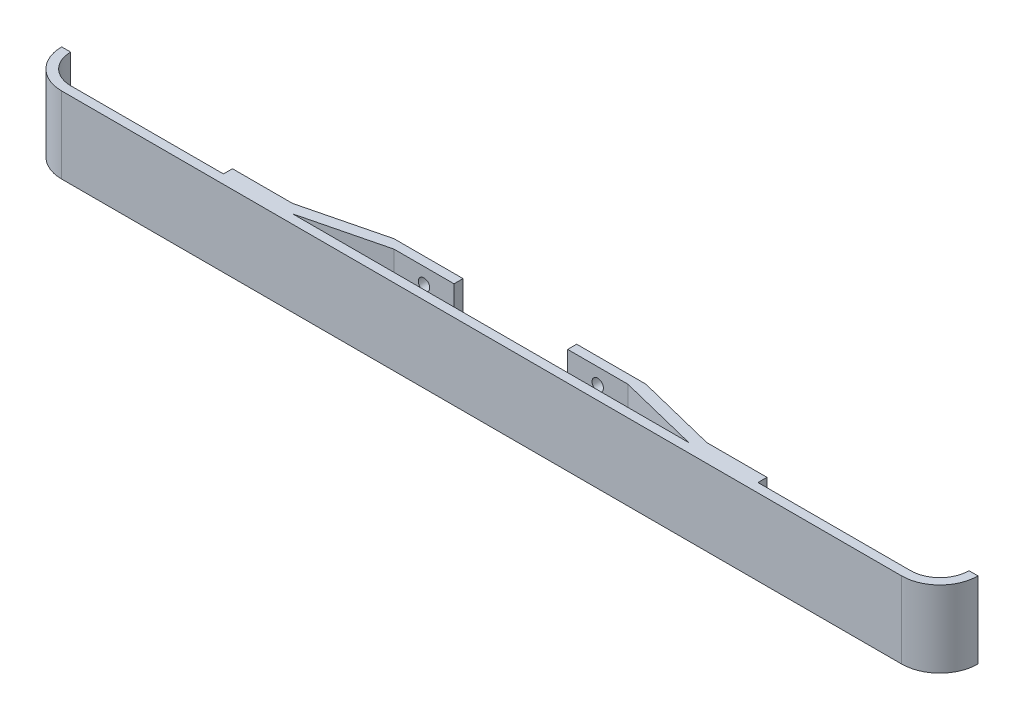
ISO-10303-21;
HEADER;
FILE_DESCRIPTION(('STEP AP214'),'2;1');
FILE_NAME('part.step','',(''),(''),'','','');
FILE_SCHEMA(('AUTOMOTIVE_DESIGN { 1 0 10303 214 1 1 1 1 }'));
ENDSEC;
DATA;
#1=APPLICATION_CONTEXT('core data for automotive mechanical design processes');
#2=APPLICATION_PROTOCOL_DEFINITION('international standard','automotive_design',2000,#1);
#3=PRODUCT_CONTEXT('',#1,'mechanical');
#4=PRODUCT('Part','Part','',(#3));
#5=PRODUCT_RELATED_PRODUCT_CATEGORY('part','',(#4));
#6=PRODUCT_DEFINITION_FORMATION('','',#4);
#7=PRODUCT_DEFINITION_CONTEXT('part definition',#1,'design');
#8=PRODUCT_DEFINITION('design','',#6,#7);
#9=PRODUCT_DEFINITION_SHAPE('','',#8);
#10=(LENGTH_UNIT() NAMED_UNIT(*) SI_UNIT(.MILLI.,.METRE.));
#11=(NAMED_UNIT(*) PLANE_ANGLE_UNIT() SI_UNIT($,.RADIAN.));
#12=(NAMED_UNIT(*) SI_UNIT($,.STERADIAN.) SOLID_ANGLE_UNIT());
#13=UNCERTAINTY_MEASURE_WITH_UNIT(LENGTH_MEASURE(1.E-05),#10,'distance_accuracy_value','');
#14=(GEOMETRIC_REPRESENTATION_CONTEXT(3) GLOBAL_UNCERTAINTY_ASSIGNED_CONTEXT((#13)) GLOBAL_UNIT_ASSIGNED_CONTEXT((#10,
#11,#12)) REPRESENTATION_CONTEXT('',''));
#15=CARTESIAN_POINT('',(0.,0.,0.));
#16=DIRECTION('',(0.,0.,1.));
#17=DIRECTION('',(1.,0.,0.));
#18=AXIS2_PLACEMENT_3D('',#15,#16,#17);
#19=CARTESIAN_POINT('',(107.466978193146,-14.8364485981308,3.));
#20=DIRECTION('',(0.,0.,-1.));
#21=DIRECTION('',(-1.,0.,0.));
#22=AXIS2_PLACEMENT_3D('',#19,#20,#21);
#23=PLANE('',#22);
#24=CARTESIAN_POINT('',(97.4669781931466,-9.63644859813084,3.00000000000002));
#25=DIRECTION('',(0.,0.,1.));
#26=DIRECTION('',(1.,0.,0.));
#27=AXIS2_PLACEMENT_3D('',#24,#25,#26);
#28=CIRCLE('',#27,1.89864999999999);
#29=CARTESIAN_POINT('',(99.3656281931465,-9.63644859813084,3.00000000000002));
#30=VERTEX_POINT('',#29);
#31=EDGE_CURVE('E756',#30,#30,#28,.T.);
#32=ORIENTED_EDGE('',*,*,#31,.F.);
#33=EDGE_LOOP('',(#32));
#34=FACE_BOUND('',#33,.T.);
#35=DIRECTION('',(-1.,0.,0.));
#36=VECTOR('',#35,1.);
#37=CARTESIAN_POINT('',(107.466978193146,10.5635514018692,3.));
#38=LINE('',#37,#36);
#39=CARTESIAN_POINT('',(107.466978193146,10.5635514018692,3.));
#40=VERTEX_POINT('',#39);
#41=CARTESIAN_POINT('',(87.4669781931464,10.5635514018692,3.));
#42=VERTEX_POINT('',#41);
#43=EDGE_CURVE('E395',#40,#42,#38,.T.);
#44=ORIENTED_EDGE('',*,*,#43,.T.);
#45=DIRECTION('',(0.,1.,0.));
#46=VECTOR('',#45,1.);
#47=CARTESIAN_POINT('',(87.4669781931464,-14.8364485981308,3.));
#48=LINE('',#47,#46);
#49=CARTESIAN_POINT('',(87.4669781931464,-14.8364485981308,3.));
#50=VERTEX_POINT('',#49);
#51=EDGE_CURVE('E407',#50,#42,#48,.T.);
#52=ORIENTED_EDGE('',*,*,#51,.F.);
#53=DIRECTION('',(-1.,0.,0.));
#54=VECTOR('',#53,1.);
#55=CARTESIAN_POINT('',(107.466978193146,-14.8364485981308,3.));
#56=LINE('',#55,#54);
#57=CARTESIAN_POINT('',(107.466978193146,-14.8364485981308,3.));
#58=VERTEX_POINT('',#57);
#59=EDGE_CURVE('E49',#58,#50,#56,.T.);
#60=ORIENTED_EDGE('',*,*,#59,.F.);
#61=DIRECTION('',(0.,1.,0.));
#62=VECTOR('',#61,1.);
#63=CARTESIAN_POINT('',(107.466978193146,-14.8364485981308,3.));
#64=LINE('',#63,#62);
#65=EDGE_CURVE('E385',#58,#40,#64,.T.);
#66=ORIENTED_EDGE('',*,*,#65,.T.);
#67=EDGE_LOOP('',(#44,#52,#60,#66));
#68=FACE_BOUND('',#67,.T.);
#69=CARTESIAN_POINT('',(97.4669781931464,5.36355140186916,3.00000000000002));
#70=DIRECTION('',(0.,0.,1.));
#71=DIRECTION('',(1.,0.,0.));
#72=AXIS2_PLACEMENT_3D('',#69,#70,#71);
#73=CIRCLE('',#72,1.89864999999999);
#74=CARTESIAN_POINT('',(99.3656281931464,5.36355140186916,3.00000000000002));
#75=VERTEX_POINT('',#74);
#76=EDGE_CURVE('E737',#75,#75,#73,.T.);
#77=ORIENTED_EDGE('',*,*,#76,.F.);
#78=EDGE_LOOP('',(#77));
#79=FACE_BOUND('',#78,.T.);
#80=ADVANCED_FACE('F34',(#34,#68,#79),#23,.F.);
#81=CARTESIAN_POINT('',(-13.3330218068536,-14.8364485981308,9.7));
#82=DIRECTION('',(0.,0.,1.));
#83=DIRECTION('',(1.,0.,0.));
#84=AXIS2_PLACEMENT_3D('',#81,#82,#83);
#85=PLANE('',#84);
#86=DIRECTION('',(0.,1.,0.));
#87=VECTOR('',#86,1.);
#88=CARTESIAN_POINT('',(37.4669781931464,10.5635514018692,9.7));
#89=LINE('',#88,#87);
#90=CARTESIAN_POINT('',(37.4669781931464,-14.8364485981308,9.7));
#91=VERTEX_POINT('',#90);
#92=CARTESIAN_POINT('',(37.4669781931464,10.5635514018692,9.7));
#93=VERTEX_POINT('',#92);
#94=EDGE_CURVE('E229',#91,#93,#89,.T.);
#95=ORIENTED_EDGE('',*,*,#94,.F.);
#96=DIRECTION('',(1.,0.,0.));
#97=VECTOR('',#96,1.);
#98=CARTESIAN_POINT('',(-13.3330218068536,-14.8364485981308,9.7));
#99=LINE('',#98,#97);
#100=CARTESIAN_POINT('',(-13.3330218068536,-14.8364485981308,9.7));
#101=VERTEX_POINT('',#100);
#102=EDGE_CURVE('E218',#101,#91,#99,.T.);
#103=ORIENTED_EDGE('',*,*,#102,.F.);
#104=DIRECTION('',(0.,1.,0.));
#105=VECTOR('',#104,1.);
#106=CARTESIAN_POINT('',(-13.3330218068536,-14.8364485981308,9.7));
#107=LINE('',#106,#105);
#108=CARTESIAN_POINT('',(-13.3330218068536,10.5635514018692,9.7));
#109=VERTEX_POINT('',#108);
#110=EDGE_CURVE('E278',#101,#109,#107,.T.);
#111=ORIENTED_EDGE('',*,*,#110,.T.);
#112=DIRECTION('',(1.,0.,0.));
#113=VECTOR('',#112,1.);
#114=CARTESIAN_POINT('',(-13.3330218068536,10.5635514018692,9.7));
#115=LINE('',#114,#113);
#116=EDGE_CURVE('E260',#109,#93,#115,.T.);
#117=ORIENTED_EDGE('',*,*,#116,.T.);
#118=EDGE_LOOP('',(#95,#103,#111,#117));
#119=FACE_BOUND('',#118,.T.);
#120=ADVANCED_FACE('F452',(#119),#85,.F.);
#121=CARTESIAN_POINT('',(60.4669781931464,-14.8364485981308,9.7));
#122=VERTEX_POINT('',#121);
#123=CARTESIAN_POINT('',(192.266978193146,-14.8364485981308,9.7));
#124=VERTEX_POINT('',#123);
#125=EDGE_CURVE('E265',#122,#124,#99,.T.);
#126=ORIENTED_EDGE('',*,*,#125,.F.);
#127=DIRECTION('',(0.,1.,0.));
#128=VECTOR('',#127,1.);
#129=CARTESIAN_POINT('',(60.4669781931464,-14.8364485981308,9.7));
#130=LINE('',#129,#128);
#131=CARTESIAN_POINT('',(60.4669781931464,10.5635514018692,9.7));
#132=VERTEX_POINT('',#131);
#133=EDGE_CURVE('E346',#122,#132,#130,.T.);
#134=ORIENTED_EDGE('',*,*,#133,.T.);
#135=CARTESIAN_POINT('',(192.266978193146,10.5635514018692,9.7));
#136=VERTEX_POINT('',#135);
#137=EDGE_CURVE('E273',#132,#136,#115,.T.);
#138=ORIENTED_EDGE('',*,*,#137,.T.);
#139=DIRECTION('',(0.,1.,0.));
#140=VECTOR('',#139,1.);
#141=CARTESIAN_POINT('',(192.266978193146,-14.8364485981308,9.7));
#142=LINE('',#141,#140);
#143=EDGE_CURVE('E343',#124,#136,#142,.T.);
#144=ORIENTED_EDGE('',*,*,#143,.F.);
#145=EDGE_LOOP('',(#126,#134,#138,#144));
#146=FACE_BOUND('',#145,.T.);
#147=ADVANCED_FACE('F342',(#146),#85,.F.);
#148=DIRECTION('',(0.,-1.,0.));
#149=VECTOR('',#148,1.);
#150=CARTESIAN_POINT('',(215.266978193146,10.5635514018692,9.7));
#151=LINE('',#150,#149);
#152=CARTESIAN_POINT('',(215.266978193146,10.5635514018692,9.7));
#153=VERTEX_POINT('',#152);
#154=CARTESIAN_POINT('',(215.266978193146,-14.8364485981308,9.7));
#155=VERTEX_POINT('',#154);
#156=EDGE_CURVE('E234',#153,#155,#151,.T.);
#157=ORIENTED_EDGE('',*,*,#156,.F.);
#158=CARTESIAN_POINT('',(266.066978193146,10.5635514018692,9.69999999999999));
#159=VERTEX_POINT('',#158);
#160=EDGE_CURVE('E270',#153,#159,#115,.T.);
#161=ORIENTED_EDGE('',*,*,#160,.T.);
#162=DIRECTION('',(0.,1.,0.));
#163=VECTOR('',#162,1.);
#164=CARTESIAN_POINT('',(266.066978193146,-14.8364485981308,9.69999999999999));
#165=LINE('',#164,#163);
#166=CARTESIAN_POINT('',(266.066978193146,-14.8364485981308,9.69999999999999));
#167=VERTEX_POINT('',#166);
#168=EDGE_CURVE('E274',#167,#159,#165,.T.);
#169=ORIENTED_EDGE('',*,*,#168,.F.);
#170=EDGE_CURVE('E262',#155,#167,#99,.T.);
#171=ORIENTED_EDGE('',*,*,#170,.F.);
#172=EDGE_LOOP('',(#157,#161,#169,#171));
#173=FACE_BOUND('',#172,.T.);
#174=ADVANCED_FACE('F334',(#173),#85,.F.);
#175=CARTESIAN_POINT('',(0.,0.,0.));
#176=DIRECTION('',(0.,0.,1.));
#177=DIRECTION('',(1.,0.,0.));
#178=AXIS2_PLACEMENT_3D('',#175,#176,#177);
#179=PLANE('',#178);
#180=DIRECTION('',(1.,0.,0.));
#181=VECTOR('',#180,1.);
#182=CARTESIAN_POINT('',(-26.0330218068536,-14.8364485981308,0.));
#183=LINE('',#182,#181);
#184=CARTESIAN_POINT('',(275.766978193146,-14.8364485981308,0.));
#185=VERTEX_POINT('',#184);
#186=CARTESIAN_POINT('',(278.766978193146,-14.8364485981308,0.));
#187=VERTEX_POINT('',#186);
#188=EDGE_CURVE('E294',#185,#187,#183,.T.);
#189=ORIENTED_EDGE('',*,*,#188,.F.);
#190=DIRECTION('',(0.,1.,0.));
#191=VECTOR('',#190,1.);
#192=CARTESIAN_POINT('',(275.766978193146,-14.8364485981308,0.));
#193=LINE('',#192,#191);
#194=CARTESIAN_POINT('',(275.766978193146,10.5635514018692,0.));
#195=VERTEX_POINT('',#194);
#196=EDGE_CURVE('E264',#185,#195,#193,.T.);
#197=ORIENTED_EDGE('',*,*,#196,.T.);
#198=DIRECTION('',(1.,0.,0.));
#199=VECTOR('',#198,1.);
#200=CARTESIAN_POINT('',(-26.0330218068536,10.5635514018692,0.));
#201=LINE('',#200,#199);
#202=CARTESIAN_POINT('',(278.766978193146,10.5635514018692,0.));
#203=VERTEX_POINT('',#202);
#204=EDGE_CURVE('E301',#195,#203,#201,.T.);
#205=ORIENTED_EDGE('',*,*,#204,.T.);
#206=DIRECTION('',(0.,-1.,0.));
#207=VECTOR('',#206,1.);
#208=CARTESIAN_POINT('',(278.766978193146,10.5635514018692,0.));
#209=LINE('',#208,#207);
#210=EDGE_CURVE('E298',#203,#187,#209,.T.);
#211=ORIENTED_EDGE('',*,*,#210,.T.);
#212=EDGE_LOOP('',(#189,#197,#205,#211));
#213=FACE_BOUND('',#212,.T.);
#214=ADVANCED_FACE('F324',(#213),#179,.F.);
#215=CARTESIAN_POINT('',(-26.0330218068536,-14.8364485981308,12.7));
#216=DIRECTION('',(0.,1.,0.));
#217=DIRECTION('',(-1.,0.,0.));
#218=AXIS2_PLACEMENT_3D('',#215,#216,#217);
#219=PLANE('',#218);
#220=DIRECTION('',(1.,0.,0.));
#221=VECTOR('',#220,1.);
#222=CARTESIAN_POINT('',(37.4669781931464,-14.8364485981308,6.7));
#223=LINE('',#222,#221);
#224=CARTESIAN_POINT('',(37.4669781931464,-14.8364485981308,6.7));
#225=VERTEX_POINT('',#224);
#226=CARTESIAN_POINT('',(57.4669781931464,-14.8364485981308,6.7));
#227=VERTEX_POINT('',#226);
#228=EDGE_CURVE('E193',#225,#227,#223,.T.);
#229=ORIENTED_EDGE('',*,*,#228,.T.);
#230=DIRECTION('',(0.970563929002576,0.,-0.24084364164138));
#231=VECTOR('',#230,1.);
#232=CARTESIAN_POINT('',(57.4669781931464,-14.8364485981308,6.7));
#233=LINE('',#232,#231);
#234=CARTESIAN_POINT('',(84.4669781931464,-14.8364485981308,0.));
#235=VERTEX_POINT('',#234);
#236=EDGE_CURVE('E204',#227,#235,#233,.T.);
#237=ORIENTED_EDGE('',*,*,#236,.T.);
#238=DIRECTION('',(-1.,0.,0.));
#239=VECTOR('',#238,1.);
#240=CARTESIAN_POINT('',(37.4669781931464,-14.8364485981308,0.));
#241=LINE('',#240,#239);
#242=CARTESIAN_POINT('',(107.466978193146,-14.8364485981308,0.));
#243=VERTEX_POINT('',#242);
#244=EDGE_CURVE('E220',#243,#235,#241,.T.);
#245=ORIENTED_EDGE('',*,*,#244,.F.);
#246=DIRECTION('',(0.,0.,1.));
#247=VECTOR('',#246,1.);
#248=CARTESIAN_POINT('',(107.466978193146,-14.8364485981308,0.));
#249=LINE('',#248,#247);
#250=EDGE_CURVE('E219',#243,#58,#249,.T.);
#251=ORIENTED_EDGE('',*,*,#250,.T.);
#252=ORIENTED_EDGE('',*,*,#59,.T.);
#253=DIRECTION('',(-0.970563929002577,0.,0.24084364164138));
#254=VECTOR('',#253,1.);
#255=CARTESIAN_POINT('',(87.4669781931464,-14.8364485981308,3.));
#256=LINE('',#255,#254);
#257=EDGE_CURVE('E398',#50,#122,#256,.T.);
#258=ORIENTED_EDGE('',*,*,#257,.T.);
#259=ORIENTED_EDGE('',*,*,#125,.T.);
#260=DIRECTION('',(-0.970563929002576,0.,-0.24084364164138));
#261=VECTOR('',#260,1.);
#262=CARTESIAN_POINT('',(192.266978193146,-14.8364485981308,9.7));
#263=LINE('',#262,#261);
#264=CARTESIAN_POINT('',(165.266978193146,-14.8364485981308,3.));
#265=VERTEX_POINT('',#264);
#266=EDGE_CURVE('E356',#124,#265,#263,.T.);
#267=ORIENTED_EDGE('',*,*,#266,.T.);
#268=DIRECTION('',(-1.,0.,0.));
#269=VECTOR('',#268,1.);
#270=CARTESIAN_POINT('',(165.266978193146,-14.8364485981308,3.));
#271=LINE('',#270,#269);
#272=CARTESIAN_POINT('',(145.266978193146,-14.8364485981308,3.));
#273=VERTEX_POINT('',#272);
#274=EDGE_CURVE('E358',#265,#273,#271,.T.);
#275=ORIENTED_EDGE('',*,*,#274,.T.);
#276=DIRECTION('',(0.,0.,1.));
#277=VECTOR('',#276,1.);
#278=CARTESIAN_POINT('',(145.266978193146,-14.8364485981308,0.));
#279=LINE('',#278,#277);
#280=CARTESIAN_POINT('',(145.266978193146,-14.8364485981308,0.));
#281=VERTEX_POINT('',#280);
#282=EDGE_CURVE('E243',#281,#273,#279,.T.);
#283=ORIENTED_EDGE('',*,*,#282,.F.);
#284=DIRECTION('',(-1.,0.,0.));
#285=VECTOR('',#284,1.);
#286=CARTESIAN_POINT('',(145.266978193146,-14.8364485981308,0.));
#287=LINE('',#286,#285);
#288=CARTESIAN_POINT('',(168.266978193146,-14.8364485981308,0.));
#289=VERTEX_POINT('',#288);
#290=EDGE_CURVE('E241',#289,#281,#287,.T.);
#291=ORIENTED_EDGE('',*,*,#290,.F.);
#292=DIRECTION('',(0.970563929002576,0.,0.24084364164138));
#293=VECTOR('',#292,1.);
#294=CARTESIAN_POINT('',(195.266978193146,-14.8364485981308,6.7));
#295=LINE('',#294,#293);
#296=CARTESIAN_POINT('',(195.266978193146,-14.8364485981308,6.7));
#297=VERTEX_POINT('',#296);
#298=EDGE_CURVE('E410',#289,#297,#295,.T.);
#299=ORIENTED_EDGE('',*,*,#298,.T.);
#300=DIRECTION('',(1.,0.,0.));
#301=VECTOR('',#300,1.);
#302=CARTESIAN_POINT('',(215.266978193146,-14.8364485981308,6.69999999999999));
#303=LINE('',#302,#301);
#304=CARTESIAN_POINT('',(215.266978193146,-14.8364485981308,6.69999999999999));
#305=VERTEX_POINT('',#304);
#306=EDGE_CURVE('E413',#297,#305,#303,.T.);
#307=ORIENTED_EDGE('',*,*,#306,.T.);
#308=DIRECTION('',(0.,0.,1.));
#309=VECTOR('',#308,1.);
#310=CARTESIAN_POINT('',(215.266978193146,-14.8364485981308,0.));
#311=LINE('',#310,#309);
#312=EDGE_CURVE('E248',#305,#155,#311,.T.);
#313=ORIENTED_EDGE('',*,*,#312,.T.);
#314=ORIENTED_EDGE('',*,*,#170,.T.);
#315=CARTESIAN_POINT('',(266.066978193146,-14.8364485981308,0.));
#316=DIRECTION('',(0.,1.,0.));
#317=DIRECTION('',(0.,0.,1.));
#318=AXIS2_PLACEMENT_3D('',#315,#316,#317);
#319=CIRCLE('',#318,9.69999999999999);
#320=EDGE_CURVE('E256',#167,#185,#319,.T.);
#321=ORIENTED_EDGE('',*,*,#320,.T.);
#322=ORIENTED_EDGE('',*,*,#188,.T.);
#323=CARTESIAN_POINT('',(266.066978193146,-14.8364485981308,0.));
#324=DIRECTION('',(0.,1.,0.));
#325=DIRECTION('',(-1.,0.,0.));
#326=AXIS2_PLACEMENT_3D('',#323,#324,#325);
#327=CIRCLE('',#326,12.7);
#328=CARTESIAN_POINT('',(266.066978193146,-14.8364485981308,12.7));
#329=VERTEX_POINT('',#328);
#330=EDGE_CURVE('E308',#187,#329,#327,.F.);
#331=ORIENTED_EDGE('',*,*,#330,.T.);
#332=DIRECTION('',(1.,0.,0.));
#333=VECTOR('',#332,1.);
#334=CARTESIAN_POINT('',(-26.0330218068536,-14.8364485981308,12.7));
#335=LINE('',#334,#333);
#336=CARTESIAN_POINT('',(-13.3330218068536,-14.8364485981308,12.7));
#337=VERTEX_POINT('',#336);
#338=EDGE_CURVE('E284',#337,#329,#335,.T.);
#339=ORIENTED_EDGE('',*,*,#338,.F.);
#340=CARTESIAN_POINT('',(-13.3330218068536,-14.8364485981308,0.));
#341=DIRECTION('',(0.,1.,0.));
#342=DIRECTION('',(-1.,0.,0.));
#343=AXIS2_PLACEMENT_3D('',#340,#341,#342);
#344=CIRCLE('',#343,12.7);
#345=CARTESIAN_POINT('',(-26.0330218068536,-14.8364485981308,0.));
#346=VERTEX_POINT('',#345);
#347=EDGE_CURVE('E310',#337,#346,#344,.F.);
#348=ORIENTED_EDGE('',*,*,#347,.T.);
#349=CARTESIAN_POINT('',(-23.0330218068536,-14.8364485981308,0.));
#350=VERTEX_POINT('',#349);
#351=EDGE_CURVE('E295',#346,#350,#183,.T.);
#352=ORIENTED_EDGE('',*,*,#351,.T.);
#353=CARTESIAN_POINT('',(-13.3330218068536,-14.8364485981308,0.));
#354=DIRECTION('',(0.,1.,0.));
#355=DIRECTION('',(0.,0.,1.));
#356=AXIS2_PLACEMENT_3D('',#353,#354,#355);
#357=CIRCLE('',#356,9.7);
#358=EDGE_CURVE('E259',#350,#101,#357,.T.);
#359=ORIENTED_EDGE('',*,*,#358,.T.);
#360=ORIENTED_EDGE('',*,*,#102,.T.);
#361=DIRECTION('',(0.,0.,1.));
#362=VECTOR('',#361,1.);
#363=CARTESIAN_POINT('',(37.4669781931464,-14.8364485981308,0.));
#364=LINE('',#363,#362);
#365=EDGE_CURVE('E210',#225,#91,#364,.T.);
#366=ORIENTED_EDGE('',*,*,#365,.F.);
#367=EDGE_LOOP('',(#229,#237,#245,#251,#252,#258,#259,#267,#275,#283,#291,#299,#307,#313,#314,
#321,#322,#331,#339,#348,#352,#359,#360,#366));
#368=FACE_BOUND('',#367,.T.);
#369=ADVANCED_FACE('F215',(#368),#219,.F.);
#370=CARTESIAN_POINT('',(-26.0330218068536,10.5635514018692,12.7));
#371=DIRECTION('',(0.,1.,0.));
#372=DIRECTION('',(0.,0.,1.));
#373=AXIS2_PLACEMENT_3D('',#370,#371,#372);
#374=PLANE('',#373);
#375=DIRECTION('',(0.970563929002576,0.,-0.24084364164138));
#376=VECTOR('',#375,1.);
#377=CARTESIAN_POINT('',(57.4669781931464,10.5635514018692,6.7));
#378=LINE('',#377,#376);
#379=CARTESIAN_POINT('',(57.4669781931464,10.5635514018692,6.7));
#380=VERTEX_POINT('',#379);
#381=CARTESIAN_POINT('',(84.4669781931464,10.5635514018692,0.));
#382=VERTEX_POINT('',#381);
#383=EDGE_CURVE('E57',#380,#382,#378,.T.);
#384=ORIENTED_EDGE('',*,*,#383,.F.);
#385=DIRECTION('',(1.,0.,0.));
#386=VECTOR('',#385,1.);
#387=CARTESIAN_POINT('',(37.4669781931464,10.5635514018692,6.7));
#388=LINE('',#387,#386);
#389=CARTESIAN_POINT('',(37.4669781931464,10.5635514018692,6.7));
#390=VERTEX_POINT('',#389);
#391=EDGE_CURVE('E389',#390,#380,#388,.T.);
#392=ORIENTED_EDGE('',*,*,#391,.F.);
#393=DIRECTION('',(0.,0.,1.));
#394=VECTOR('',#393,1.);
#395=CARTESIAN_POINT('',(37.4669781931464,10.5635514018692,0.));
#396=LINE('',#395,#394);
#397=EDGE_CURVE('E212',#390,#93,#396,.T.);
#398=ORIENTED_EDGE('',*,*,#397,.T.);
#399=ORIENTED_EDGE('',*,*,#116,.F.);
#400=CARTESIAN_POINT('',(-13.3330218068536,10.5635514018692,0.));
#401=DIRECTION('',(0.,1.,0.));
#402=DIRECTION('',(0.,0.,1.));
#403=AXIS2_PLACEMENT_3D('',#400,#401,#402);
#404=CIRCLE('',#403,9.7);
#405=CARTESIAN_POINT('',(-23.0330218068536,10.5635514018692,0.));
#406=VERTEX_POINT('',#405);
#407=EDGE_CURVE('E267',#406,#109,#404,.T.);
#408=ORIENTED_EDGE('',*,*,#407,.F.);
#409=CARTESIAN_POINT('',(-26.0330218068536,10.5635514018692,0.));
#410=VERTEX_POINT('',#409);
#411=EDGE_CURVE('E288',#410,#406,#201,.T.);
#412=ORIENTED_EDGE('',*,*,#411,.F.);
#413=CARTESIAN_POINT('',(-13.3330218068536,10.5635514018692,0.));
#414=DIRECTION('',(0.,1.,0.));
#415=DIRECTION('',(0.,0.,1.));
#416=AXIS2_PLACEMENT_3D('',#413,#414,#415);
#417=CIRCLE('',#416,12.7);
#418=CARTESIAN_POINT('',(-13.3330218068536,10.5635514018692,12.7));
#419=VERTEX_POINT('',#418);
#420=EDGE_CURVE('E11',#410,#419,#417,.T.);
#421=ORIENTED_EDGE('',*,*,#420,.T.);
#422=DIRECTION('',(1.,0.,0.));
#423=VECTOR('',#422,1.);
#424=CARTESIAN_POINT('',(-26.0330218068536,10.5635514018692,12.7));
#425=LINE('',#424,#423);
#426=CARTESIAN_POINT('',(266.066978193146,10.5635514018692,12.7));
#427=VERTEX_POINT('',#426);
#428=EDGE_CURVE('E287',#419,#427,#425,.T.);
#429=ORIENTED_EDGE('',*,*,#428,.T.);
#430=CARTESIAN_POINT('',(266.066978193146,10.5635514018692,0.));
#431=DIRECTION('',(0.,1.,0.));
#432=DIRECTION('',(0.,0.,1.));
#433=AXIS2_PLACEMENT_3D('',#430,#431,#432);
#434=CIRCLE('',#433,12.7);
#435=EDGE_CURVE('E42',#427,#203,#434,.T.);
#436=ORIENTED_EDGE('',*,*,#435,.T.);
#437=ORIENTED_EDGE('',*,*,#204,.F.);
#438=CARTESIAN_POINT('',(266.066978193146,10.5635514018692,0.));
#439=DIRECTION('',(0.,1.,0.));
#440=DIRECTION('',(0.,0.,1.));
#441=AXIS2_PLACEMENT_3D('',#438,#439,#440);
#442=CIRCLE('',#441,9.69999999999999);
#443=EDGE_CURVE('E255',#159,#195,#442,.T.);
#444=ORIENTED_EDGE('',*,*,#443,.F.);
#445=ORIENTED_EDGE('',*,*,#160,.F.);
#446=DIRECTION('',(0.,0.,1.));
#447=VECTOR('',#446,1.);
#448=CARTESIAN_POINT('',(215.266978193146,10.5635514018692,0.));
#449=LINE('',#448,#447);
#450=CARTESIAN_POINT('',(215.266978193146,10.5635514018692,6.69999999999999));
#451=VERTEX_POINT('',#450);
#452=EDGE_CURVE('E250',#451,#153,#449,.T.);
#453=ORIENTED_EDGE('',*,*,#452,.F.);
#454=DIRECTION('',(1.,0.,0.));
#455=VECTOR('',#454,1.);
#456=CARTESIAN_POINT('',(215.266978193146,10.5635514018692,6.69999999999999));
#457=LINE('',#456,#455);
#458=CARTESIAN_POINT('',(195.266978193146,10.5635514018692,6.7));
#459=VERTEX_POINT('',#458);
#460=EDGE_CURVE('E414',#459,#451,#457,.T.);
#461=ORIENTED_EDGE('',*,*,#460,.F.);
#462=DIRECTION('',(0.970563929002576,0.,0.24084364164138));
#463=VECTOR('',#462,1.);
#464=CARTESIAN_POINT('',(195.266978193146,10.5635514018692,6.7));
#465=LINE('',#464,#463);
#466=CARTESIAN_POINT('',(168.266978193146,10.5635514018692,0.));
#467=VERTEX_POINT('',#466);
#468=EDGE_CURVE('E406',#467,#459,#465,.T.);
#469=ORIENTED_EDGE('',*,*,#468,.F.);
#470=DIRECTION('',(1.,0.,0.));
#471=VECTOR('',#470,1.);
#472=CARTESIAN_POINT('',(145.266978193146,10.5635514018692,0.));
#473=LINE('',#472,#471);
#474=CARTESIAN_POINT('',(145.266978193146,10.5635514018692,0.));
#475=VERTEX_POINT('',#474);
#476=EDGE_CURVE('E238',#475,#467,#473,.T.);
#477=ORIENTED_EDGE('',*,*,#476,.F.);
#478=DIRECTION('',(0.,0.,1.));
#479=VECTOR('',#478,1.);
#480=CARTESIAN_POINT('',(145.266978193146,10.5635514018692,0.));
#481=LINE('',#480,#479);
#482=CARTESIAN_POINT('',(145.266978193146,10.5635514018692,3.));
#483=VERTEX_POINT('',#482);
#484=EDGE_CURVE('E252',#475,#483,#481,.T.);
#485=ORIENTED_EDGE('',*,*,#484,.T.);
#486=DIRECTION('',(-1.,0.,0.));
#487=VECTOR('',#486,1.);
#488=CARTESIAN_POINT('',(165.266978193146,10.5635514018692,3.));
#489=LINE('',#488,#487);
#490=CARTESIAN_POINT('',(165.266978193146,10.5635514018692,3.));
#491=VERTEX_POINT('',#490);
#492=EDGE_CURVE('E360',#491,#483,#489,.T.);
#493=ORIENTED_EDGE('',*,*,#492,.F.);
#494=DIRECTION('',(-0.970563929002576,0.,-0.24084364164138));
#495=VECTOR('',#494,1.);
#496=CARTESIAN_POINT('',(192.266978193146,10.5635514018692,9.7));
#497=LINE('',#496,#495);
#498=EDGE_CURVE('E353',#136,#491,#497,.T.);
#499=ORIENTED_EDGE('',*,*,#498,.F.);
#500=ORIENTED_EDGE('',*,*,#137,.F.);
#501=DIRECTION('',(-0.970563929002577,0.,0.24084364164138));
#502=VECTOR('',#501,1.);
#503=CARTESIAN_POINT('',(87.4669781931464,10.5635514018692,3.));
#504=LINE('',#503,#502);
#505=EDGE_CURVE('E399',#42,#132,#504,.T.);
#506=ORIENTED_EDGE('',*,*,#505,.F.);
#507=ORIENTED_EDGE('',*,*,#43,.F.);
#508=DIRECTION('',(0.,0.,1.));
#509=VECTOR('',#508,1.);
#510=CARTESIAN_POINT('',(107.466978193146,10.5635514018692,0.));
#511=LINE('',#510,#509);
#512=CARTESIAN_POINT('',(107.466978193146,10.5635514018692,0.));
#513=VERTEX_POINT('',#512);
#514=EDGE_CURVE('E223',#513,#40,#511,.T.);
#515=ORIENTED_EDGE('',*,*,#514,.F.);
#516=DIRECTION('',(1.,0.,0.));
#517=VECTOR('',#516,1.);
#518=CARTESIAN_POINT('',(37.4669781931464,10.5635514018692,0.));
#519=LINE('',#518,#517);
#520=EDGE_CURVE('E374',#382,#513,#519,.T.);
#521=ORIENTED_EDGE('',*,*,#520,.F.);
#522=EDGE_LOOP('',(#384,#392,#398,#399,#408,#412,#421,#429,#436,#437,#444,#445,#453,#461,#469,
#477,#485,#493,#499,#500,#506,#507,#515,#521));
#523=FACE_BOUND('',#522,.T.);
#524=ADVANCED_FACE('F316',(#523),#374,.T.);
#525=CARTESIAN_POINT('',(0.,0.,12.7));
#526=DIRECTION('',(0.,0.,1.));
#527=DIRECTION('',(1.,0.,0.));
#528=AXIS2_PLACEMENT_3D('',#525,#526,#527);
#529=PLANE('',#528);
#530=ORIENTED_EDGE('',*,*,#428,.F.);
#531=DIRECTION('',(0.,-1.,0.));
#532=VECTOR('',#531,1.);
#533=CARTESIAN_POINT('',(-13.3330218068536,-14.8364485981308,12.7));
#534=LINE('',#533,#532);
#535=EDGE_CURVE('E305',#419,#337,#534,.T.);
#536=ORIENTED_EDGE('',*,*,#535,.T.);
#537=ORIENTED_EDGE('',*,*,#338,.T.);
#538=DIRECTION('',(0.,-1.,0.));
#539=VECTOR('',#538,1.);
#540=CARTESIAN_POINT('',(266.066978193146,0.,12.7));
#541=LINE('',#540,#539);
#542=EDGE_CURVE('E291',#329,#427,#541,.F.);
#543=ORIENTED_EDGE('',*,*,#542,.T.);
#544=EDGE_LOOP('',(#530,#536,#537,#543));
#545=FACE_BOUND('',#544,.T.);
#546=ADVANCED_FACE('F614',(#545),#529,.T.);
#547=ORIENTED_EDGE('',*,*,#411,.T.);
#548=DIRECTION('',(0.,1.,0.));
#549=VECTOR('',#548,1.);
#550=CARTESIAN_POINT('',(-23.0330218068536,-14.8364485981308,0.));
#551=LINE('',#550,#549);
#552=EDGE_CURVE('E280',#350,#406,#551,.T.);
#553=ORIENTED_EDGE('',*,*,#552,.F.);
#554=ORIENTED_EDGE('',*,*,#351,.F.);
#555=DIRECTION('',(0.,-1.,0.));
#556=VECTOR('',#555,1.);
#557=CARTESIAN_POINT('',(-26.0330218068536,10.5635514018692,0.));
#558=LINE('',#557,#556);
#559=EDGE_CURVE('E277',#410,#346,#558,.T.);
#560=ORIENTED_EDGE('',*,*,#559,.F.);
#561=EDGE_LOOP('',(#547,#553,#554,#560));
#562=FACE_BOUND('',#561,.T.);
#563=ADVANCED_FACE('F624',(#562),#179,.F.);
#564=CARTESIAN_POINT('',(-13.3330218068536,0.,0.));
#565=DIRECTION('',(0.,1.,0.));
#566=DIRECTION('',(0.,0.,1.));
#567=AXIS2_PLACEMENT_3D('',#564,#565,#566);
#568=CYLINDRICAL_SURFACE('',#567,12.7);
#569=ORIENTED_EDGE('',*,*,#420,.F.);
#570=ORIENTED_EDGE('',*,*,#559,.T.);
#571=ORIENTED_EDGE('',*,*,#347,.F.);
#572=ORIENTED_EDGE('',*,*,#535,.F.);
#573=EDGE_LOOP('',(#569,#570,#571,#572));
#574=FACE_BOUND('',#573,.T.);
#575=ADVANCED_FACE('F633',(#574),#568,.T.);
#576=CARTESIAN_POINT('',(266.066978193146,10.5635514018692,0.));
#577=DIRECTION('',(0.,-1.,0.));
#578=DIRECTION('',(0.,0.,-1.));
#579=AXIS2_PLACEMENT_3D('',#576,#577,#578);
#580=CYLINDRICAL_SURFACE('',#579,12.7);
#581=ORIENTED_EDGE('',*,*,#435,.F.);
#582=ORIENTED_EDGE('',*,*,#542,.F.);
#583=ORIENTED_EDGE('',*,*,#330,.F.);
#584=ORIENTED_EDGE('',*,*,#210,.F.);
#585=EDGE_LOOP('',(#581,#582,#583,#584));
#586=FACE_BOUND('',#585,.T.);
#587=ADVANCED_FACE('F36',(#586),#580,.T.);
#588=CARTESIAN_POINT('',(266.066978193146,-14.8364485981308,0.));
#589=DIRECTION('',(0.,1.,0.));
#590=DIRECTION('',(0.,0.,1.));
#591=AXIS2_PLACEMENT_3D('',#588,#589,#590);
#592=CYLINDRICAL_SURFACE('',#591,9.69999999999999);
#593=ORIENTED_EDGE('',*,*,#443,.T.);
#594=ORIENTED_EDGE('',*,*,#196,.F.);
#595=ORIENTED_EDGE('',*,*,#320,.F.);
#596=ORIENTED_EDGE('',*,*,#168,.T.);
#597=EDGE_LOOP('',(#593,#594,#595,#596));
#598=FACE_BOUND('',#597,.T.);
#599=ADVANCED_FACE('F327',(#598),#592,.F.);
#600=CARTESIAN_POINT('',(-13.3330218068536,-14.8364485981308,0.));
#601=DIRECTION('',(0.,1.,0.));
#602=DIRECTION('',(0.,0.,1.));
#603=AXIS2_PLACEMENT_3D('',#600,#601,#602);
#604=CYLINDRICAL_SURFACE('',#603,9.7);
#605=ORIENTED_EDGE('',*,*,#407,.T.);
#606=ORIENTED_EDGE('',*,*,#110,.F.);
#607=ORIENTED_EDGE('',*,*,#358,.F.);
#608=ORIENTED_EDGE('',*,*,#552,.T.);
#609=EDGE_LOOP('',(#605,#606,#607,#608));
#610=FACE_BOUND('',#609,.T.);
#611=ADVANCED_FACE('F449',(#610),#604,.F.);
#612=CARTESIAN_POINT('',(145.266978193146,10.5635514018692,0.));
#613=DIRECTION('',(1.,0.,0.));
#614=DIRECTION('',(0.,0.,-1.));
#615=AXIS2_PLACEMENT_3D('',#612,#613,#614);
#616=PLANE('',#615);
#617=ORIENTED_EDGE('',*,*,#282,.T.);
#618=DIRECTION('',(0.,1.,0.));
#619=VECTOR('',#618,1.);
#620=CARTESIAN_POINT('',(145.266978193146,-14.8364485981308,3.));
#621=LINE('',#620,#619);
#622=EDGE_CURVE('E370',#273,#483,#621,.T.);
#623=ORIENTED_EDGE('',*,*,#622,.T.);
#624=ORIENTED_EDGE('',*,*,#484,.F.);
#625=DIRECTION('',(0.,1.,0.));
#626=VECTOR('',#625,1.);
#627=CARTESIAN_POINT('',(145.266978193146,10.5635514018692,0.));
#628=LINE('',#627,#626);
#629=EDGE_CURVE('E235',#281,#475,#628,.T.);
#630=ORIENTED_EDGE('',*,*,#629,.F.);
#631=EDGE_LOOP('',(#617,#623,#624,#630));
#632=FACE_BOUND('',#631,.T.);
#633=ADVANCED_FACE('F428',(#632),#616,.F.);
#634=CARTESIAN_POINT('',(215.266978193146,10.5635514018692,0.));
#635=DIRECTION('',(-1.,0.,0.));
#636=DIRECTION('',(0.,0.,1.));
#637=AXIS2_PLACEMENT_3D('',#634,#635,#636);
#638=PLANE('',#637);
#639=ORIENTED_EDGE('',*,*,#312,.F.);
#640=DIRECTION('',(0.,1.,0.));
#641=VECTOR('',#640,1.);
#642=CARTESIAN_POINT('',(215.266978193146,-14.8364485981308,6.69999999999999));
#643=LINE('',#642,#641);
#644=EDGE_CURVE('E361',#305,#451,#643,.T.);
#645=ORIENTED_EDGE('',*,*,#644,.T.);
#646=ORIENTED_EDGE('',*,*,#452,.T.);
#647=ORIENTED_EDGE('',*,*,#156,.T.);
#648=EDGE_LOOP('',(#639,#645,#646,#647));
#649=FACE_BOUND('',#648,.T.);
#650=ADVANCED_FACE('F440',(#649),#638,.F.);
#651=CARTESIAN_POINT('',(0.,0.,0.));
#652=DIRECTION('',(0.,0.,1.));
#653=DIRECTION('',(1.,0.,0.));
#654=AXIS2_PLACEMENT_3D('',#651,#652,#653);
#655=PLANE('',#654);
#656=CARTESIAN_POINT('',(155.266978193146,5.36355140186916,0.));
#657=DIRECTION('',(0.,0.,1.));
#658=DIRECTION('',(1.,0.,0.));
#659=AXIS2_PLACEMENT_3D('',#656,#657,#658);
#660=CIRCLE('',#659,1.89864999999999);
#661=CARTESIAN_POINT('',(157.165628193146,5.36355140186916,0.));
#662=VERTEX_POINT('',#661);
#663=EDGE_CURVE('E747',#662,#662,#660,.T.);
#664=ORIENTED_EDGE('',*,*,#663,.T.);
#665=EDGE_LOOP('',(#664));
#666=FACE_BOUND('',#665,.T.);
#667=CARTESIAN_POINT('',(155.266978193147,-9.63644859813084,0.));
#668=DIRECTION('',(0.,0.,1.));
#669=DIRECTION('',(1.,0.,0.));
#670=AXIS2_PLACEMENT_3D('',#667,#668,#669);
#671=CIRCLE('',#670,1.89865);
#672=CARTESIAN_POINT('',(157.165628193147,-9.63644859813084,0.));
#673=VERTEX_POINT('',#672);
#674=EDGE_CURVE('E753',#673,#673,#671,.T.);
#675=ORIENTED_EDGE('',*,*,#674,.T.);
#676=EDGE_LOOP('',(#675));
#677=FACE_BOUND('',#676,.T.);
#678=ORIENTED_EDGE('',*,*,#476,.T.);
#679=DIRECTION('',(0.,1.,0.));
#680=VECTOR('',#679,1.);
#681=CARTESIAN_POINT('',(168.266978193146,-14.8364485981308,0.));
#682=LINE('',#681,#680);
#683=EDGE_CURVE('E416',#289,#467,#682,.T.);
#684=ORIENTED_EDGE('',*,*,#683,.F.);
#685=ORIENTED_EDGE('',*,*,#290,.T.);
#686=ORIENTED_EDGE('',*,*,#629,.T.);
#687=EDGE_LOOP('',(#678,#684,#685,#686));
#688=FACE_BOUND('',#687,.T.);
#689=ADVANCED_FACE('F431',(#666,#677,#688),#655,.F.);
#690=CARTESIAN_POINT('',(37.4669781931464,10.5635514018692,0.));
#691=DIRECTION('',(1.,0.,0.));
#692=DIRECTION('',(0.,0.,-1.));
#693=AXIS2_PLACEMENT_3D('',#690,#691,#692);
#694=PLANE('',#693);
#695=ORIENTED_EDGE('',*,*,#397,.F.);
#696=DIRECTION('',(0.,1.,0.));
#697=VECTOR('',#696,1.);
#698=CARTESIAN_POINT('',(37.4669781931464,-14.8364485981308,6.7));
#699=LINE('',#698,#697);
#700=EDGE_CURVE('E197',#225,#390,#699,.T.);
#701=ORIENTED_EDGE('',*,*,#700,.F.);
#702=ORIENTED_EDGE('',*,*,#365,.T.);
#703=ORIENTED_EDGE('',*,*,#94,.T.);
#704=EDGE_LOOP('',(#695,#701,#702,#703));
#705=FACE_BOUND('',#704,.T.);
#706=ADVANCED_FACE('F208',(#705),#694,.F.);
#707=CARTESIAN_POINT('',(107.466978193146,10.5635514018692,0.));
#708=DIRECTION('',(-1.,0.,0.));
#709=DIRECTION('',(0.,0.,1.));
#710=AXIS2_PLACEMENT_3D('',#707,#708,#709);
#711=PLANE('',#710);
#712=ORIENTED_EDGE('',*,*,#514,.T.);
#713=ORIENTED_EDGE('',*,*,#65,.F.);
#714=ORIENTED_EDGE('',*,*,#250,.F.);
#715=DIRECTION('',(0.,-1.,0.));
#716=VECTOR('',#715,1.);
#717=CARTESIAN_POINT('',(107.466978193146,10.5635514018692,0.));
#718=LINE('',#717,#716);
#719=EDGE_CURVE('E226',#513,#243,#718,.T.);
#720=ORIENTED_EDGE('',*,*,#719,.F.);
#721=EDGE_LOOP('',(#712,#713,#714,#720));
#722=FACE_BOUND('',#721,.T.);
#723=ADVANCED_FACE('F384',(#722),#711,.F.);
#724=CARTESIAN_POINT('',(0.,0.,0.));
#725=DIRECTION('',(0.,0.,1.));
#726=DIRECTION('',(1.,0.,0.));
#727=AXIS2_PLACEMENT_3D('',#724,#725,#726);
#728=PLANE('',#727);
#729=CARTESIAN_POINT('',(97.4669781931464,5.36355140186916,0.));
#730=DIRECTION('',(0.,0.,1.));
#731=DIRECTION('',(1.,0.,0.));
#732=AXIS2_PLACEMENT_3D('',#729,#730,#731);
#733=CIRCLE('',#732,1.89864999999999);
#734=CARTESIAN_POINT('',(99.3656281931464,5.36355140186916,0.));
#735=VERTEX_POINT('',#734);
#736=EDGE_CURVE('E739',#735,#735,#733,.T.);
#737=ORIENTED_EDGE('',*,*,#736,.T.);
#738=EDGE_LOOP('',(#737));
#739=FACE_BOUND('',#738,.T.);
#740=CARTESIAN_POINT('',(97.4669781931466,-9.63644859813084,0.));
#741=DIRECTION('',(0.,0.,1.));
#742=DIRECTION('',(1.,0.,0.));
#743=AXIS2_PLACEMENT_3D('',#740,#741,#742);
#744=CIRCLE('',#743,1.89864999999999);
#745=CARTESIAN_POINT('',(99.3656281931466,-9.63644859813084,0.));
#746=VERTEX_POINT('',#745);
#747=EDGE_CURVE('E391',#746,#746,#744,.T.);
#748=ORIENTED_EDGE('',*,*,#747,.T.);
#749=EDGE_LOOP('',(#748));
#750=FACE_BOUND('',#749,.T.);
#751=ORIENTED_EDGE('',*,*,#244,.T.);
#752=DIRECTION('',(0.,1.,0.));
#753=VECTOR('',#752,1.);
#754=CARTESIAN_POINT('',(84.4669781931464,-14.8364485981308,0.));
#755=LINE('',#754,#753);
#756=EDGE_CURVE('E393',#235,#382,#755,.T.);
#757=ORIENTED_EDGE('',*,*,#756,.T.);
#758=ORIENTED_EDGE('',*,*,#520,.T.);
#759=ORIENTED_EDGE('',*,*,#719,.T.);
#760=EDGE_LOOP('',(#751,#757,#758,#759));
#761=FACE_BOUND('',#760,.T.);
#762=ADVANCED_FACE('F379',(#739,#750,#761),#728,.F.);
#763=CARTESIAN_POINT('',(215.266978193146,-14.8364485981308,6.69999999999999));
#764=DIRECTION('',(0.,0.,1.));
#765=DIRECTION('',(1.,0.,0.));
#766=AXIS2_PLACEMENT_3D('',#763,#764,#765);
#767=PLANE('',#766);
#768=ORIENTED_EDGE('',*,*,#460,.T.);
#769=ORIENTED_EDGE('',*,*,#644,.F.);
#770=ORIENTED_EDGE('',*,*,#306,.F.);
#771=DIRECTION('',(0.,1.,0.));
#772=VECTOR('',#771,1.);
#773=CARTESIAN_POINT('',(195.266978193146,-14.8364485981308,6.7));
#774=LINE('',#773,#772);
#775=EDGE_CURVE('E365',#297,#459,#774,.T.);
#776=ORIENTED_EDGE('',*,*,#775,.T.);
#777=EDGE_LOOP('',(#768,#769,#770,#776));
#778=FACE_BOUND('',#777,.T.);
#779=ADVANCED_FACE('F438',(#778),#767,.F.);
#780=CARTESIAN_POINT('',(195.266978193146,-14.8364485981308,6.7));
#781=DIRECTION('',(-0.24084364164138,0.,0.970563929002577));
#782=DIRECTION('',(0.970563929002577,0.,0.24084364164138));
#783=AXIS2_PLACEMENT_3D('',#780,#781,#782);
#784=PLANE('',#783);
#785=ORIENTED_EDGE('',*,*,#468,.T.);
#786=ORIENTED_EDGE('',*,*,#775,.F.);
#787=ORIENTED_EDGE('',*,*,#298,.F.);
#788=ORIENTED_EDGE('',*,*,#683,.T.);
#789=EDGE_LOOP('',(#785,#786,#787,#788));
#790=FACE_BOUND('',#789,.T.);
#791=ADVANCED_FACE('F435',(#790),#784,.F.);
#792=CARTESIAN_POINT('',(165.266978193146,-14.8364485981308,3.));
#793=DIRECTION('',(0.,0.,-1.));
#794=DIRECTION('',(-1.,0.,0.));
#795=AXIS2_PLACEMENT_3D('',#792,#793,#794);
#796=PLANE('',#795);
#797=CARTESIAN_POINT('',(155.266978193146,5.36355140186916,3.00000000000002));
#798=DIRECTION('',(0.,0.,1.));
#799=DIRECTION('',(1.,0.,0.));
#800=AXIS2_PLACEMENT_3D('',#797,#798,#799);
#801=CIRCLE('',#800,1.89864999999997);
#802=CARTESIAN_POINT('',(157.165628193146,5.36355140186916,3.00000000000002));
#803=VERTEX_POINT('',#802);
#804=EDGE_CURVE('E742',#803,#803,#801,.T.);
#805=ORIENTED_EDGE('',*,*,#804,.F.);
#806=EDGE_LOOP('',(#805));
#807=FACE_BOUND('',#806,.T.);
#808=CARTESIAN_POINT('',(155.266978193147,-9.63644859813084,3.00000000000002));
#809=DIRECTION('',(0.,0.,1.));
#810=DIRECTION('',(1.,0.,0.));
#811=AXIS2_PLACEMENT_3D('',#808,#809,#810);
#812=CIRCLE('',#811,1.89865);
#813=CARTESIAN_POINT('',(157.165628193147,-9.63644859813084,3.00000000000002));
#814=VERTEX_POINT('',#813);
#815=EDGE_CURVE('E750',#814,#814,#812,.T.);
#816=ORIENTED_EDGE('',*,*,#815,.F.);
#817=EDGE_LOOP('',(#816));
#818=FACE_BOUND('',#817,.T.);
#819=ORIENTED_EDGE('',*,*,#492,.T.);
#820=ORIENTED_EDGE('',*,*,#622,.F.);
#821=ORIENTED_EDGE('',*,*,#274,.F.);
#822=DIRECTION('',(0.,1.,0.));
#823=VECTOR('',#822,1.);
#824=CARTESIAN_POINT('',(165.266978193146,-14.8364485981308,3.));
#825=LINE('',#824,#823);
#826=EDGE_CURVE('E357',#265,#491,#825,.T.);
#827=ORIENTED_EDGE('',*,*,#826,.T.);
#828=EDGE_LOOP('',(#819,#820,#821,#827));
#829=FACE_BOUND('',#828,.T.);
#830=ADVANCED_FACE('F469',(#807,#818,#829),#796,.F.);
#831=CARTESIAN_POINT('',(192.266978193146,-14.8364485981308,9.7));
#832=DIRECTION('',(0.24084364164138,0.,-0.970563929002577));
#833=DIRECTION('',(-0.970563929002577,0.,-0.24084364164138));
#834=AXIS2_PLACEMENT_3D('',#831,#832,#833);
#835=PLANE('',#834);
#836=ORIENTED_EDGE('',*,*,#498,.T.);
#837=ORIENTED_EDGE('',*,*,#826,.F.);
#838=ORIENTED_EDGE('',*,*,#266,.F.);
#839=ORIENTED_EDGE('',*,*,#143,.T.);
#840=EDGE_LOOP('',(#836,#837,#838,#839));
#841=FACE_BOUND('',#840,.T.);
#842=ADVANCED_FACE('F352',(#841),#835,.F.);
#843=CARTESIAN_POINT('',(57.4669781931464,-14.8364485981308,6.7));
#844=DIRECTION('',(0.24084364164138,0.,0.970563929002577));
#845=DIRECTION('',(0.970563929002577,0.,-0.24084364164138));
#846=AXIS2_PLACEMENT_3D('',#843,#844,#845);
#847=PLANE('',#846);
#848=ORIENTED_EDGE('',*,*,#383,.T.);
#849=ORIENTED_EDGE('',*,*,#756,.F.);
#850=ORIENTED_EDGE('',*,*,#236,.F.);
#851=DIRECTION('',(0.,1.,0.));
#852=VECTOR('',#851,1.);
#853=CARTESIAN_POINT('',(57.4669781931464,-14.8364485981308,6.7));
#854=LINE('',#853,#852);
#855=EDGE_CURVE('E199',#227,#380,#854,.T.);
#856=ORIENTED_EDGE('',*,*,#855,.T.);
#857=EDGE_LOOP('',(#848,#849,#850,#856));
#858=FACE_BOUND('',#857,.T.);
#859=ADVANCED_FACE('F475',(#858),#847,.F.);
#860=CARTESIAN_POINT('',(37.4669781931464,-14.8364485981308,6.7));
#861=DIRECTION('',(0.,0.,1.));
#862=DIRECTION('',(1.,0.,0.));
#863=AXIS2_PLACEMENT_3D('',#860,#861,#862);
#864=PLANE('',#863);
#865=ORIENTED_EDGE('',*,*,#391,.T.);
#866=ORIENTED_EDGE('',*,*,#855,.F.);
#867=ORIENTED_EDGE('',*,*,#228,.F.);
#868=ORIENTED_EDGE('',*,*,#700,.T.);
#869=EDGE_LOOP('',(#865,#866,#867,#868));
#870=FACE_BOUND('',#869,.T.);
#871=ADVANCED_FACE('F196',(#870),#864,.F.);
#872=CARTESIAN_POINT('',(87.4669781931464,-14.8364485981308,3.));
#873=DIRECTION('',(-0.24084364164138,0.,-0.970563929002577));
#874=DIRECTION('',(-0.970563929002577,0.,0.24084364164138));
#875=AXIS2_PLACEMENT_3D('',#872,#873,#874);
#876=PLANE('',#875);
#877=ORIENTED_EDGE('',*,*,#505,.T.);
#878=ORIENTED_EDGE('',*,*,#133,.F.);
#879=ORIENTED_EDGE('',*,*,#257,.F.);
#880=ORIENTED_EDGE('',*,*,#51,.T.);
#881=EDGE_LOOP('',(#877,#878,#879,#880));
#882=FACE_BOUND('',#881,.T.);
#883=ADVANCED_FACE('F463',(#882),#876,.F.);
#884=CARTESIAN_POINT('',(97.4669781931466,-9.63644859813084,3.00000000000001));
#885=DIRECTION('',(0.,0.,1.));
#886=DIRECTION('',(1.,0.,0.));
#887=AXIS2_PLACEMENT_3D('',#884,#885,#886);
#888=CYLINDRICAL_SURFACE('',#887,1.89864999999999);
#889=ORIENTED_EDGE('',*,*,#747,.F.);
#890=EDGE_LOOP('',(#889));
#891=FACE_BOUND('',#890,.T.);
#892=ORIENTED_EDGE('',*,*,#31,.T.);
#893=EDGE_LOOP('',(#892));
#894=FACE_BOUND('',#893,.T.);
#895=ADVANCED_FACE('F530',(#891,#894),#888,.F.);
#896=CARTESIAN_POINT('',(155.266978193147,-9.63644859813084,3.00000000000001));
#897=DIRECTION('',(0.,0.,1.));
#898=DIRECTION('',(1.,0.,0.));
#899=AXIS2_PLACEMENT_3D('',#896,#897,#898);
#900=CYLINDRICAL_SURFACE('',#899,1.89865);
#901=ORIENTED_EDGE('',*,*,#674,.F.);
#902=EDGE_LOOP('',(#901));
#903=FACE_BOUND('',#902,.T.);
#904=ORIENTED_EDGE('',*,*,#815,.T.);
#905=EDGE_LOOP('',(#904));
#906=FACE_BOUND('',#905,.T.);
#907=ADVANCED_FACE('F536',(#903,#906),#900,.F.);
#908=CARTESIAN_POINT('',(155.266978193146,5.36355140186916,3.00000000000001));
#909=DIRECTION('',(0.,0.,1.));
#910=DIRECTION('',(1.,0.,0.));
#911=AXIS2_PLACEMENT_3D('',#908,#909,#910);
#912=CYLINDRICAL_SURFACE('',#911,1.89864999999999);
#913=ORIENTED_EDGE('',*,*,#663,.F.);
#914=EDGE_LOOP('',(#913));
#915=FACE_BOUND('',#914,.T.);
#916=ORIENTED_EDGE('',*,*,#804,.T.);
#917=EDGE_LOOP('',(#916));
#918=FACE_BOUND('',#917,.T.);
#919=ADVANCED_FACE('F544',(#915,#918),#912,.F.);
#920=CARTESIAN_POINT('',(97.4669781931464,5.36355140186916,3.00000000000001));
#921=DIRECTION('',(0.,0.,1.));
#922=DIRECTION('',(1.,0.,0.));
#923=AXIS2_PLACEMENT_3D('',#920,#921,#922);
#924=CYLINDRICAL_SURFACE('',#923,1.89864999999999);
#925=ORIENTED_EDGE('',*,*,#736,.F.);
#926=EDGE_LOOP('',(#925));
#927=FACE_BOUND('',#926,.T.);
#928=ORIENTED_EDGE('',*,*,#76,.T.);
#929=EDGE_LOOP('',(#928));
#930=FACE_BOUND('',#929,.T.);
#931=ADVANCED_FACE('F552',(#927,#930),#924,.F.);
#932=CLOSED_SHELL('',(#80,#120,#147,#174,#214,#369,#524,#546,#563,#575,#587,#599,#611,#633,#650,
#689,#706,#723,#762,#779,#791,#830,#842,#859,#871,#883,#895,#907,#919,#931));
#933=MANIFOLD_SOLID_BREP('B2',#932);
#934=ADVANCED_BREP_SHAPE_REPRESENTATION('',(#18,#933),#14);
#935=SHAPE_DEFINITION_REPRESENTATION(#9,#934);
ENDSEC;
END-ISO-10303-21;
